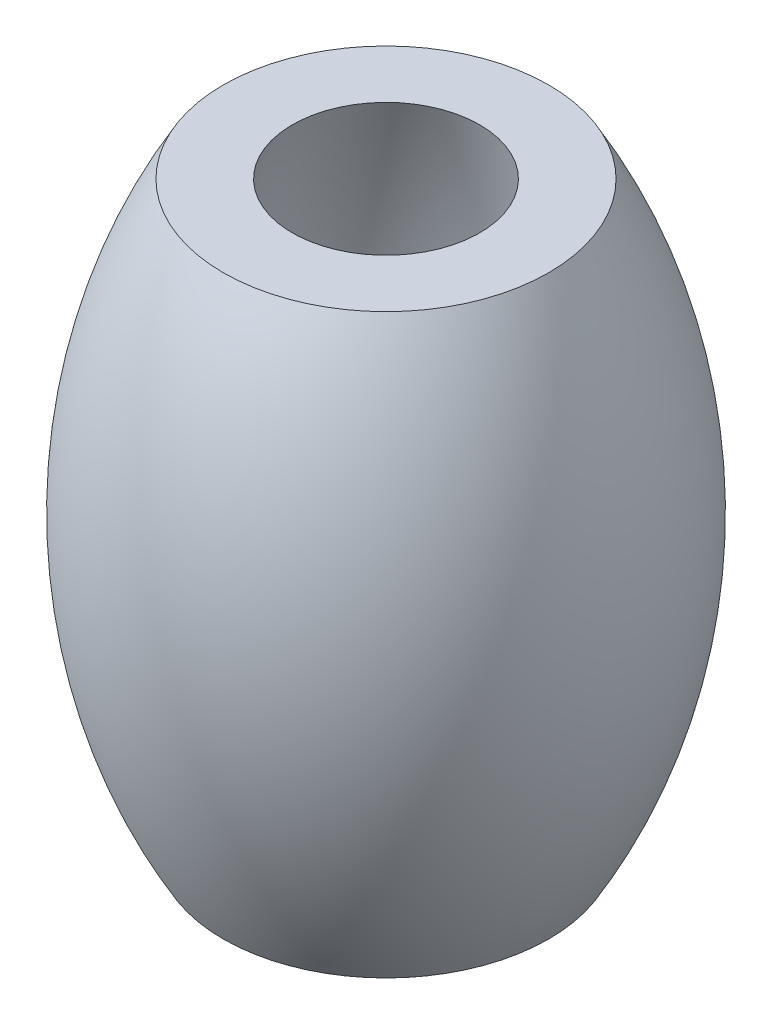
ISO-10303-21;
HEADER;
FILE_DESCRIPTION(('STEP AP214'),'2;1');
FILE_NAME('part.step','',(''),(''),'','','');
FILE_SCHEMA(('AUTOMOTIVE_DESIGN { 1 0 10303 214 1 1 1 1 }'));
ENDSEC;
DATA;
#1=APPLICATION_CONTEXT('core data for automotive mechanical design processes');
#2=APPLICATION_PROTOCOL_DEFINITION('international standard','automotive_design',2000,#1);
#3=PRODUCT_CONTEXT('',#1,'mechanical');
#4=PRODUCT('Part','Part','',(#3));
#5=PRODUCT_RELATED_PRODUCT_CATEGORY('part','',(#4));
#6=PRODUCT_DEFINITION_FORMATION('','',#4);
#7=PRODUCT_DEFINITION_CONTEXT('part definition',#1,'design');
#8=PRODUCT_DEFINITION('design','',#6,#7);
#9=PRODUCT_DEFINITION_SHAPE('','',#8);
#10=(LENGTH_UNIT() NAMED_UNIT(*) SI_UNIT(.MILLI.,.METRE.));
#11=(NAMED_UNIT(*) PLANE_ANGLE_UNIT() SI_UNIT($,.RADIAN.));
#12=(NAMED_UNIT(*) SI_UNIT($,.STERADIAN.) SOLID_ANGLE_UNIT());
#13=UNCERTAINTY_MEASURE_WITH_UNIT(LENGTH_MEASURE(1.E-05),#10,'distance_accuracy_value','');
#14=(GEOMETRIC_REPRESENTATION_CONTEXT(3) GLOBAL_UNCERTAINTY_ASSIGNED_CONTEXT((#13)) GLOBAL_UNIT_ASSIGNED_CONTEXT((#10,
#11,#12)) REPRESENTATION_CONTEXT('',''));
#15=CARTESIAN_POINT('',(0.,0.,0.));
#16=DIRECTION('',(0.,0.,1.));
#17=DIRECTION('',(1.,0.,0.));
#18=AXIS2_PLACEMENT_3D('',#15,#16,#17);
#19=CARTESIAN_POINT('',(22.4999999999948,-1.16000468594151E-13,0.));
#20=DIRECTION('',(0.,-1.,0.));
#21=DIRECTION('',(0.,0.,-1.));
#22=AXIS2_PLACEMENT_3D('',#19,#20,#21);
#23=DEGENERATE_TOROIDAL_SURFACE('',#22,22.5000000000042,27.0000000000043,.F.);
#24=CARTESIAN_POINT('',(22.4999999999948,-9.0500000000001,-1.56477527109249E-13));
#25=DIRECTION('',(0.,-1.,0.));
#26=DIRECTION('',(0.,0.,-1.));
#27=AXIS2_PLACEMENT_3D('',#24,#25,#26);
#28=CIRCLE('',#27,2.93811117201944);
#29=CARTESIAN_POINT('',(22.4999999999948,-9.05000000000008,-2.93811117201959));
#30=VERTEX_POINT('',#29);
#31=EDGE_CURVE('E27',#30,#30,#28,.T.);
#32=ORIENTED_EDGE('',*,*,#31,.T.);
#33=EDGE_LOOP('',(#32));
#34=FACE_BOUND('',#33,.T.);
#35=CARTESIAN_POINT('',(22.4999999999947,9.04999999999997,0.));
#36=DIRECTION('',(0.,-1.,0.));
#37=DIRECTION('',(0.,0.,-1.));
#38=AXIS2_PLACEMENT_3D('',#35,#36,#37);
#39=CIRCLE('',#38,2.9381111720194);
#40=CARTESIAN_POINT('',(22.4999999999947,9.05,-2.93811117201939));
#41=VERTEX_POINT('',#40);
#42=EDGE_CURVE('E18',#41,#41,#39,.T.);
#43=ORIENTED_EDGE('',*,*,#42,.F.);
#44=EDGE_LOOP('',(#43));
#45=FACE_BOUND('',#44,.T.);
#46=ADVANCED_FACE('F14',(#34,#45),#23,.T.);
#47=CARTESIAN_POINT('',(22.5,9.05,0.));
#48=DIRECTION('',(0.,1.,0.));
#49=DIRECTION('',(0.,0.,1.));
#50=AXIS2_PLACEMENT_3D('',#47,#48,#49);
#51=PLANE('',#50);
#52=ORIENTED_EDGE('',*,*,#42,.T.);
#53=EDGE_LOOP('',(#52));
#54=FACE_BOUND('',#53,.T.);
#55=CARTESIAN_POINT('',(22.5000000000053,9.04999999999998,0.));
#56=DIRECTION('',(0.,1.,0.));
#57=DIRECTION('',(-1.,0.,0.));
#58=AXIS2_PLACEMENT_3D('',#55,#56,#57);
#59=CIRCLE('',#58,5.10240729218424);
#60=CARTESIAN_POINT('',(17.3975927078211,9.04999999999998,0.));
#61=VERTEX_POINT('',#60);
#62=EDGE_CURVE('E22',#61,#61,#59,.T.);
#63=ORIENTED_EDGE('',*,*,#62,.T.);
#64=EDGE_LOOP('',(#63));
#65=FACE_BOUND('',#64,.T.);
#66=ADVANCED_FACE('F35',(#54,#65),#51,.T.);
#67=CARTESIAN_POINT('',(22.5,-9.05,0.));
#68=DIRECTION('',(0.,1.,0.));
#69=DIRECTION('',(0.,0.,1.));
#70=AXIS2_PLACEMENT_3D('',#67,#68,#69);
#71=PLANE('',#70);
#72=ORIENTED_EDGE('',*,*,#31,.F.);
#73=EDGE_LOOP('',(#72));
#74=FACE_BOUND('',#73,.T.);
#75=CARTESIAN_POINT('',(22.5000000000053,-9.04999999999997,0.));
#76=DIRECTION('',(0.,1.,0.));
#77=DIRECTION('',(-1.,0.,0.));
#78=AXIS2_PLACEMENT_3D('',#75,#76,#77);
#79=CIRCLE('',#78,5.10240729218426);
#80=CARTESIAN_POINT('',(17.3975927078211,-9.04999999999997,0.));
#81=VERTEX_POINT('',#80);
#82=EDGE_CURVE('E10',#81,#81,#79,.F.);
#83=ORIENTED_EDGE('',*,*,#82,.T.);
#84=EDGE_LOOP('',(#83));
#85=FACE_BOUND('',#84,.T.);
#86=ADVANCED_FACE('F43',(#74,#85),#71,.F.);
#87=CARTESIAN_POINT('',(22.5000000000053,0.,0.));
#88=DIRECTION('',(0.,1.,0.));
#89=DIRECTION('',(-1.,0.,0.));
#90=AXIS2_PLACEMENT_3D('',#87,#88,#89);
#91=DEGENERATE_TOROIDAL_SURFACE('',#90,10.5726525163143,18.1000000000002,.F.);
#92=ORIENTED_EDGE('',*,*,#82,.F.);
#93=EDGE_LOOP('',(#92));
#94=FACE_BOUND('',#93,.T.);
#95=ORIENTED_EDGE('',*,*,#62,.F.);
#96=EDGE_LOOP('',(#95));
#97=FACE_BOUND('',#96,.T.);
#98=ADVANCED_FACE('F16',(#94,#97),#91,.F.);
#99=CLOSED_SHELL('',(#46,#66,#86,#98));
#100=MANIFOLD_SOLID_BREP('B1',#99);
#101=ADVANCED_BREP_SHAPE_REPRESENTATION('',(#18,#100),#14);
#102=SHAPE_DEFINITION_REPRESENTATION(#9,#101);
ENDSEC;
END-ISO-10303-21;
